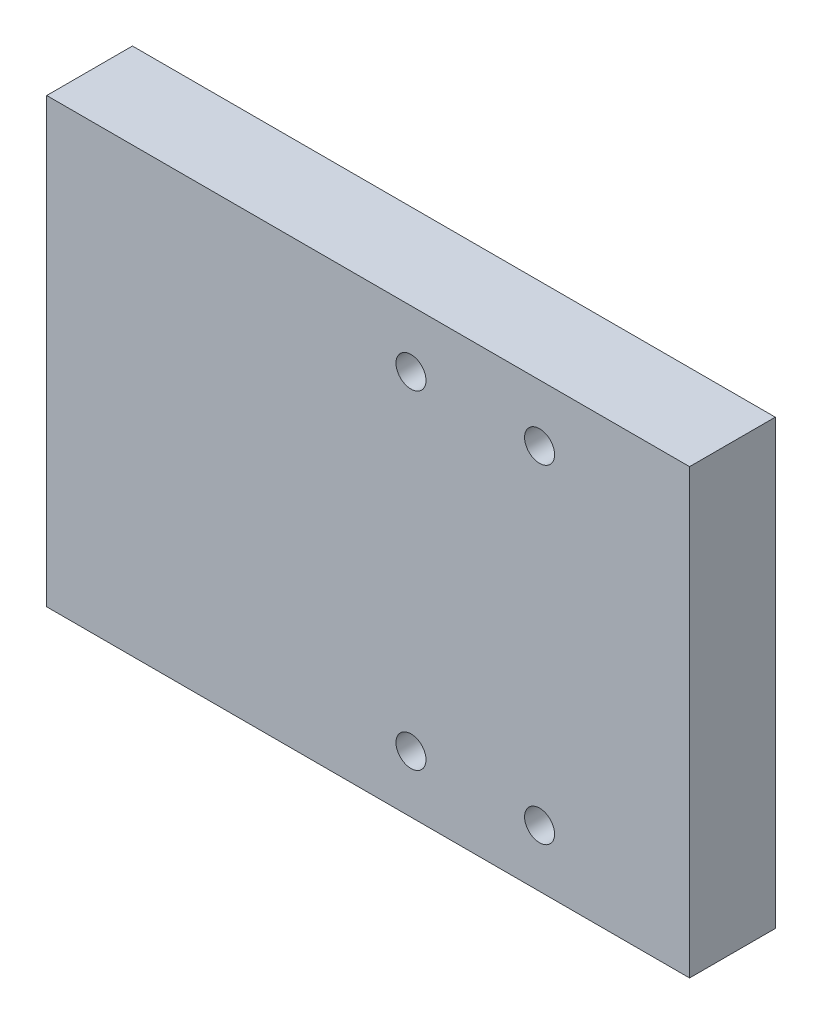
ISO-10303-21;
HEADER;
FILE_DESCRIPTION(('STEP AP214'),'2;1');
FILE_NAME('part.step','',(''),(''),'','','');
FILE_SCHEMA(('AUTOMOTIVE_DESIGN { 1 0 10303 214 1 1 1 1 }'));
ENDSEC;
DATA;
#1=APPLICATION_CONTEXT('core data for automotive mechanical design processes');
#2=APPLICATION_PROTOCOL_DEFINITION('international standard','automotive_design',2000,#1);
#3=PRODUCT_CONTEXT('',#1,'mechanical');
#4=PRODUCT('Part','Part','',(#3));
#5=PRODUCT_RELATED_PRODUCT_CATEGORY('part','',(#4));
#6=PRODUCT_DEFINITION_FORMATION('','',#4);
#7=PRODUCT_DEFINITION_CONTEXT('part definition',#1,'design');
#8=PRODUCT_DEFINITION('design','',#6,#7);
#9=PRODUCT_DEFINITION_SHAPE('','',#8);
#10=(LENGTH_UNIT() NAMED_UNIT(*) SI_UNIT(.MILLI.,.METRE.));
#11=(NAMED_UNIT(*) PLANE_ANGLE_UNIT() SI_UNIT($,.RADIAN.));
#12=(NAMED_UNIT(*) SI_UNIT($,.STERADIAN.) SOLID_ANGLE_UNIT());
#13=UNCERTAINTY_MEASURE_WITH_UNIT(LENGTH_MEASURE(1.E-05),#10,'distance_accuracy_value','');
#14=(GEOMETRIC_REPRESENTATION_CONTEXT(3) GLOBAL_UNCERTAINTY_ASSIGNED_CONTEXT((#13)) GLOBAL_UNIT_ASSIGNED_CONTEXT((#10,
#11,#12)) REPRESENTATION_CONTEXT('',''));
#15=CARTESIAN_POINT('',(0.,0.,0.));
#16=DIRECTION('',(0.,0.,1.));
#17=DIRECTION('',(1.,0.,0.));
#18=AXIS2_PLACEMENT_3D('',#15,#16,#17);
#19=CARTESIAN_POINT('',(27.9999999999999,331.,12.));
#20=DIRECTION('',(1.,0.,0.));
#21=DIRECTION('',(0.,0.,-1.));
#22=AXIS2_PLACEMENT_3D('',#19,#20,#21);
#23=PLANE('',#22);
#24=CARTESIAN_POINT('',(27.9999999999999,286.,6.00000000000001));
#25=DIRECTION('',(-1.,0.,0.));
#26=DIRECTION('',(0.,0.,1.));
#27=AXIS2_PLACEMENT_3D('',#24,#25,#26);
#28=CIRCLE('',#27,2.09999999999999);
#29=CARTESIAN_POINT('',(27.9999999999999,286.,8.1));
#30=VERTEX_POINT('',#29);
#31=EDGE_CURVE('E101',#30,#30,#28,.T.);
#32=ORIENTED_EDGE('',*,*,#31,.F.);
#33=EDGE_LOOP('',(#32));
#34=FACE_BOUND('',#33,.T.);
#35=CARTESIAN_POINT('',(27.9999999999999,314.,6.));
#36=DIRECTION('',(-1.,0.,0.));
#37=DIRECTION('',(0.,0.,1.));
#38=AXIS2_PLACEMENT_3D('',#35,#36,#37);
#39=CIRCLE('',#38,2.09999999999999);
#40=CARTESIAN_POINT('',(27.9999999999999,314.,8.09999999999999));
#41=VERTEX_POINT('',#40);
#42=EDGE_CURVE('E100',#41,#41,#39,.T.);
#43=ORIENTED_EDGE('',*,*,#42,.F.);
#44=EDGE_LOOP('',(#43));
#45=FACE_BOUND('',#44,.T.);
#46=DIRECTION('',(0.,-1.,0.));
#47=VECTOR('',#46,1.);
#48=CARTESIAN_POINT('',(27.9999999999999,331.,0.));
#49=LINE('',#48,#47);
#50=CARTESIAN_POINT('',(27.9999999999999,331.,0.));
#51=VERTEX_POINT('',#50);
#52=CARTESIAN_POINT('',(27.9999999999999,269.,0.));
#53=VERTEX_POINT('',#52);
#54=EDGE_CURVE('E132',#51,#53,#49,.T.);
#55=ORIENTED_EDGE('',*,*,#54,.T.);
#56=DIRECTION('',(0.,0.,-1.));
#57=VECTOR('',#56,1.);
#58=CARTESIAN_POINT('',(27.9999999999999,269.,12.));
#59=LINE('',#58,#57);
#60=CARTESIAN_POINT('',(27.9999999999999,269.,12.));
#61=VERTEX_POINT('',#60);
#62=EDGE_CURVE('E11',#61,#53,#59,.T.);
#63=ORIENTED_EDGE('',*,*,#62,.F.);
#64=DIRECTION('',(0.,-1.,0.));
#65=VECTOR('',#64,1.);
#66=CARTESIAN_POINT('',(27.9999999999999,331.,12.));
#67=LINE('',#66,#65);
#68=CARTESIAN_POINT('',(27.9999999999999,331.,12.));
#69=VERTEX_POINT('',#68);
#70=EDGE_CURVE('E133',#69,#61,#67,.T.);
#71=ORIENTED_EDGE('',*,*,#70,.F.);
#72=DIRECTION('',(0.,0.,-1.));
#73=VECTOR('',#72,1.);
#74=CARTESIAN_POINT('',(27.9999999999999,331.,12.));
#75=LINE('',#74,#73);
#76=EDGE_CURVE('E139',#69,#51,#75,.T.);
#77=ORIENTED_EDGE('',*,*,#76,.T.);
#78=EDGE_LOOP('',(#55,#63,#71,#77));
#79=FACE_BOUND('',#78,.T.);
#80=ADVANCED_FACE('F35',(#34,#45,#79),#23,.F.);
#81=CARTESIAN_POINT('',(27.9999999999999,269.,12.));
#82=DIRECTION('',(0.,1.,0.));
#83=DIRECTION('',(0.,0.,1.));
#84=AXIS2_PLACEMENT_3D('',#81,#82,#83);
#85=PLANE('',#84);
#86=DIRECTION('',(1.,0.,0.));
#87=VECTOR('',#86,1.);
#88=CARTESIAN_POINT('',(27.9999999999999,269.,0.));
#89=LINE('',#88,#87);
#90=CARTESIAN_POINT('',(118.,269.,0.));
#91=VERTEX_POINT('',#90);
#92=EDGE_CURVE('E142',#53,#91,#89,.T.);
#93=ORIENTED_EDGE('',*,*,#92,.T.);
#94=DIRECTION('',(0.,0.,-1.));
#95=VECTOR('',#94,1.);
#96=CARTESIAN_POINT('',(118.,269.,12.));
#97=LINE('',#96,#95);
#98=CARTESIAN_POINT('',(118.,269.,12.));
#99=VERTEX_POINT('',#98);
#100=EDGE_CURVE('E44',#99,#91,#97,.T.);
#101=ORIENTED_EDGE('',*,*,#100,.F.);
#102=DIRECTION('',(1.,0.,0.));
#103=VECTOR('',#102,1.);
#104=CARTESIAN_POINT('',(27.9999999999999,269.,12.));
#105=LINE('',#104,#103);
#106=EDGE_CURVE('E83',#61,#99,#105,.T.);
#107=ORIENTED_EDGE('',*,*,#106,.F.);
#108=ORIENTED_EDGE('',*,*,#62,.T.);
#109=EDGE_LOOP('',(#93,#101,#107,#108));
#110=FACE_BOUND('',#109,.T.);
#111=ADVANCED_FACE('F167',(#110),#85,.F.);
#112=CARTESIAN_POINT('',(118.,331.,12.));
#113=DIRECTION('',(-1.,0.,0.));
#114=DIRECTION('',(0.,0.,1.));
#115=AXIS2_PLACEMENT_3D('',#112,#113,#114);
#116=PLANE('',#115);
#117=DIRECTION('',(0.,1.,0.));
#118=VECTOR('',#117,1.);
#119=CARTESIAN_POINT('',(118.,331.,0.));
#120=LINE('',#119,#118);
#121=CARTESIAN_POINT('',(118.,331.,0.));
#122=VERTEX_POINT('',#121);
#123=EDGE_CURVE('E70',#91,#122,#120,.T.);
#124=ORIENTED_EDGE('',*,*,#123,.T.);
#125=DIRECTION('',(0.,0.,-1.));
#126=VECTOR('',#125,1.);
#127=CARTESIAN_POINT('',(118.,331.,12.));
#128=LINE('',#127,#126);
#129=CARTESIAN_POINT('',(118.,331.,12.));
#130=VERTEX_POINT('',#129);
#131=EDGE_CURVE('E147',#130,#122,#128,.T.);
#132=ORIENTED_EDGE('',*,*,#131,.F.);
#133=DIRECTION('',(0.,1.,0.));
#134=VECTOR('',#133,1.);
#135=CARTESIAN_POINT('',(118.,331.,12.));
#136=LINE('',#135,#134);
#137=EDGE_CURVE('E136',#99,#130,#136,.T.);
#138=ORIENTED_EDGE('',*,*,#137,.F.);
#139=ORIENTED_EDGE('',*,*,#100,.T.);
#140=EDGE_LOOP('',(#124,#132,#138,#139));
#141=FACE_BOUND('',#140,.T.);
#142=ADVANCED_FACE('F150',(#141),#116,.F.);
#143=CARTESIAN_POINT('',(27.9999999999999,331.,12.));
#144=DIRECTION('',(0.,-1.,0.));
#145=DIRECTION('',(0.,0.,-1.));
#146=AXIS2_PLACEMENT_3D('',#143,#144,#145);
#147=PLANE('',#146);
#148=DIRECTION('',(-1.,0.,0.));
#149=VECTOR('',#148,1.);
#150=CARTESIAN_POINT('',(27.9999999999999,331.,0.));
#151=LINE('',#150,#149);
#152=EDGE_CURVE('E76',#122,#51,#151,.T.);
#153=ORIENTED_EDGE('',*,*,#152,.T.);
#154=ORIENTED_EDGE('',*,*,#76,.F.);
#155=DIRECTION('',(-1.,0.,0.));
#156=VECTOR('',#155,1.);
#157=CARTESIAN_POINT('',(27.9999999999999,331.,12.));
#158=LINE('',#157,#156);
#159=EDGE_CURVE('E52',#130,#69,#158,.T.);
#160=ORIENTED_EDGE('',*,*,#159,.F.);
#161=ORIENTED_EDGE('',*,*,#131,.T.);
#162=EDGE_LOOP('',(#153,#154,#160,#161));
#163=FACE_BOUND('',#162,.T.);
#164=ADVANCED_FACE('F157',(#163),#147,.F.);
#165=CARTESIAN_POINT('',(0.,0.,12.));
#166=DIRECTION('',(0.,0.,1.));
#167=DIRECTION('',(1.,0.,0.));
#168=AXIS2_PLACEMENT_3D('',#165,#166,#167);
#169=PLANE('',#168);
#170=CARTESIAN_POINT('',(96.9999999999998,323.,12.));
#171=DIRECTION('',(0.,0.,1.));
#172=DIRECTION('',(1.,0.,0.));
#173=AXIS2_PLACEMENT_3D('',#170,#171,#172);
#174=CIRCLE('',#173,2.09999999999999);
#175=CARTESIAN_POINT('',(99.0999999999998,323.,12.));
#176=VERTEX_POINT('',#175);
#177=EDGE_CURVE('E111',#176,#176,#174,.T.);
#178=ORIENTED_EDGE('',*,*,#177,.F.);
#179=EDGE_LOOP('',(#178));
#180=FACE_BOUND('',#179,.T.);
#181=CARTESIAN_POINT('',(78.9999999999998,323.,12.));
#182=DIRECTION('',(0.,0.,1.));
#183=DIRECTION('',(1.,0.,0.));
#184=AXIS2_PLACEMENT_3D('',#181,#182,#183);
#185=CIRCLE('',#184,2.09999999999999);
#186=CARTESIAN_POINT('',(81.0999999999998,323.,12.));
#187=VERTEX_POINT('',#186);
#188=EDGE_CURVE('E117',#187,#187,#185,.T.);
#189=ORIENTED_EDGE('',*,*,#188,.F.);
#190=EDGE_LOOP('',(#189));
#191=FACE_BOUND('',#190,.T.);
#192=CARTESIAN_POINT('',(78.9999999999999,277.,12.));
#193=DIRECTION('',(0.,0.,1.));
#194=DIRECTION('',(1.,0.,0.));
#195=AXIS2_PLACEMENT_3D('',#192,#193,#194);
#196=CIRCLE('',#195,2.09999999999999);
#197=CARTESIAN_POINT('',(81.0999999999999,277.,12.));
#198=VERTEX_POINT('',#197);
#199=EDGE_CURVE('E123',#198,#198,#196,.T.);
#200=ORIENTED_EDGE('',*,*,#199,.F.);
#201=EDGE_LOOP('',(#200));
#202=FACE_BOUND('',#201,.T.);
#203=CARTESIAN_POINT('',(96.9999999999999,277.,12.));
#204=DIRECTION('',(0.,0.,1.));
#205=DIRECTION('',(1.,0.,0.));
#206=AXIS2_PLACEMENT_3D('',#203,#204,#205);
#207=CIRCLE('',#206,2.09999999999999);
#208=CARTESIAN_POINT('',(99.0999999999999,277.,12.));
#209=VERTEX_POINT('',#208);
#210=EDGE_CURVE('E126',#209,#209,#207,.T.);
#211=ORIENTED_EDGE('',*,*,#210,.F.);
#212=EDGE_LOOP('',(#211));
#213=FACE_BOUND('',#212,.T.);
#214=ORIENTED_EDGE('',*,*,#70,.T.);
#215=ORIENTED_EDGE('',*,*,#106,.T.);
#216=ORIENTED_EDGE('',*,*,#137,.T.);
#217=ORIENTED_EDGE('',*,*,#159,.T.);
#218=EDGE_LOOP('',(#214,#215,#216,#217));
#219=FACE_BOUND('',#218,.T.);
#220=ADVANCED_FACE('F159',(#180,#191,#202,#213,#219),#169,.T.);
#221=CARTESIAN_POINT('',(0.,0.,0.));
#222=DIRECTION('',(0.,0.,1.));
#223=DIRECTION('',(1.,0.,0.));
#224=AXIS2_PLACEMENT_3D('',#221,#222,#223);
#225=PLANE('',#224);
#226=CARTESIAN_POINT('',(96.9999999999998,323.,0.));
#227=DIRECTION('',(0.,0.,1.));
#228=DIRECTION('',(1.,0.,0.));
#229=AXIS2_PLACEMENT_3D('',#226,#227,#228);
#230=CIRCLE('',#229,2.09999999999999);
#231=CARTESIAN_POINT('',(99.0999999999998,323.,0.));
#232=VERTEX_POINT('',#231);
#233=EDGE_CURVE('E114',#232,#232,#230,.T.);
#234=ORIENTED_EDGE('',*,*,#233,.T.);
#235=EDGE_LOOP('',(#234));
#236=FACE_BOUND('',#235,.T.);
#237=CARTESIAN_POINT('',(78.9999999999998,323.,0.));
#238=DIRECTION('',(0.,0.,1.));
#239=DIRECTION('',(1.,0.,0.));
#240=AXIS2_PLACEMENT_3D('',#237,#238,#239);
#241=CIRCLE('',#240,2.09999999999999);
#242=CARTESIAN_POINT('',(81.0999999999998,323.,0.));
#243=VERTEX_POINT('',#242);
#244=EDGE_CURVE('E120',#243,#243,#241,.T.);
#245=ORIENTED_EDGE('',*,*,#244,.T.);
#246=EDGE_LOOP('',(#245));
#247=FACE_BOUND('',#246,.T.);
#248=CARTESIAN_POINT('',(78.9999999999999,277.,0.));
#249=DIRECTION('',(0.,0.,1.));
#250=DIRECTION('',(1.,0.,0.));
#251=AXIS2_PLACEMENT_3D('',#248,#249,#250);
#252=CIRCLE('',#251,2.09999999999999);
#253=CARTESIAN_POINT('',(81.0999999999999,277.,0.));
#254=VERTEX_POINT('',#253);
#255=EDGE_CURVE('E38',#254,#254,#252,.T.);
#256=ORIENTED_EDGE('',*,*,#255,.T.);
#257=EDGE_LOOP('',(#256));
#258=FACE_BOUND('',#257,.T.);
#259=CARTESIAN_POINT('',(96.9999999999999,277.,0.));
#260=DIRECTION('',(0.,0.,1.));
#261=DIRECTION('',(1.,0.,0.));
#262=AXIS2_PLACEMENT_3D('',#259,#260,#261);
#263=CIRCLE('',#262,2.09999999999999);
#264=CARTESIAN_POINT('',(99.0999999999999,277.,0.));
#265=VERTEX_POINT('',#264);
#266=EDGE_CURVE('E129',#265,#265,#263,.T.);
#267=ORIENTED_EDGE('',*,*,#266,.T.);
#268=EDGE_LOOP('',(#267));
#269=FACE_BOUND('',#268,.T.);
#270=ORIENTED_EDGE('',*,*,#54,.F.);
#271=ORIENTED_EDGE('',*,*,#152,.F.);
#272=ORIENTED_EDGE('',*,*,#123,.F.);
#273=ORIENTED_EDGE('',*,*,#92,.F.);
#274=EDGE_LOOP('',(#270,#271,#272,#273));
#275=FACE_BOUND('',#274,.T.);
#276=ADVANCED_FACE('F153',(#236,#247,#258,#269,#275),#225,.F.);
#277=CARTESIAN_POINT('',(96.9999999999999,277.,12.));
#278=DIRECTION('',(0.,0.,1.));
#279=DIRECTION('',(1.,0.,0.));
#280=AXIS2_PLACEMENT_3D('',#277,#278,#279);
#281=CYLINDRICAL_SURFACE('',#280,2.09999999999999);
#282=ORIENTED_EDGE('',*,*,#210,.T.);
#283=EDGE_LOOP('',(#282));
#284=FACE_BOUND('',#283,.T.);
#285=ORIENTED_EDGE('',*,*,#266,.F.);
#286=EDGE_LOOP('',(#285));
#287=FACE_BOUND('',#286,.T.);
#288=ADVANCED_FACE('F202',(#284,#287),#281,.F.);
#289=CARTESIAN_POINT('',(78.9999999999999,277.,12.));
#290=DIRECTION('',(0.,0.,1.));
#291=DIRECTION('',(1.,0.,0.));
#292=AXIS2_PLACEMENT_3D('',#289,#290,#291);
#293=CYLINDRICAL_SURFACE('',#292,2.09999999999999);
#294=ORIENTED_EDGE('',*,*,#199,.T.);
#295=EDGE_LOOP('',(#294));
#296=FACE_BOUND('',#295,.T.);
#297=ORIENTED_EDGE('',*,*,#255,.F.);
#298=EDGE_LOOP('',(#297));
#299=FACE_BOUND('',#298,.T.);
#300=ADVANCED_FACE('F198',(#296,#299),#293,.F.);
#301=CARTESIAN_POINT('',(78.9999999999998,323.,12.));
#302=DIRECTION('',(0.,0.,1.));
#303=DIRECTION('',(1.,0.,0.));
#304=AXIS2_PLACEMENT_3D('',#301,#302,#303);
#305=CYLINDRICAL_SURFACE('',#304,2.09999999999999);
#306=ORIENTED_EDGE('',*,*,#188,.T.);
#307=EDGE_LOOP('',(#306));
#308=FACE_BOUND('',#307,.T.);
#309=ORIENTED_EDGE('',*,*,#244,.F.);
#310=EDGE_LOOP('',(#309));
#311=FACE_BOUND('',#310,.T.);
#312=ADVANCED_FACE('F194',(#308,#311),#305,.F.);
#313=CARTESIAN_POINT('',(96.9999999999998,323.,12.));
#314=DIRECTION('',(0.,0.,1.));
#315=DIRECTION('',(1.,0.,0.));
#316=AXIS2_PLACEMENT_3D('',#313,#314,#315);
#317=CYLINDRICAL_SURFACE('',#316,2.09999999999999);
#318=ORIENTED_EDGE('',*,*,#177,.T.);
#319=EDGE_LOOP('',(#318));
#320=FACE_BOUND('',#319,.T.);
#321=ORIENTED_EDGE('',*,*,#233,.F.);
#322=EDGE_LOOP('',(#321));
#323=FACE_BOUND('',#322,.T.);
#324=ADVANCED_FACE('F186',(#320,#323),#317,.F.);
#325=CARTESIAN_POINT('',(47.9999999999999,314.,6.));
#326=DIRECTION('',(-1.,0.,0.));
#327=DIRECTION('',(0.,0.,1.));
#328=AXIS2_PLACEMENT_3D('',#325,#326,#327);
#329=CONICAL_SURFACE('',#328,2.09999999999999,1.02974425867666);
#330=CARTESIAN_POINT('',(49.2618072999578,314.,6.));
#331=VERTEX_POINT('',#330);
#332=VERTEX_LOOP('',#331);
#333=FACE_BOUND('',#332,.T.);
#334=CARTESIAN_POINT('',(47.9999999999999,314.,6.));
#335=DIRECTION('',(-1.,0.,0.));
#336=DIRECTION('',(0.,0.,1.));
#337=AXIS2_PLACEMENT_3D('',#334,#335,#336);
#338=CIRCLE('',#337,2.09999999999999);
#339=CARTESIAN_POINT('',(47.9999999999999,314.,8.09999999999999));
#340=VERTEX_POINT('',#339);
#341=EDGE_CURVE('E104',#340,#340,#338,.T.);
#342=ORIENTED_EDGE('',*,*,#341,.T.);
#343=EDGE_LOOP('',(#342));
#344=FACE_BOUND('',#343,.T.);
#345=ADVANCED_FACE('F180',(#333,#344),#329,.F.);
#346=CARTESIAN_POINT('',(27.9999999999999,314.,6.));
#347=DIRECTION('',(-1.,0.,0.));
#348=DIRECTION('',(0.,0.,1.));
#349=AXIS2_PLACEMENT_3D('',#346,#347,#348);
#350=CYLINDRICAL_SURFACE('',#349,2.09999999999999);
#351=ORIENTED_EDGE('',*,*,#341,.F.);
#352=EDGE_LOOP('',(#351));
#353=FACE_BOUND('',#352,.T.);
#354=ORIENTED_EDGE('',*,*,#42,.T.);
#355=EDGE_LOOP('',(#354));
#356=FACE_BOUND('',#355,.T.);
#357=ADVANCED_FACE('F94',(#353,#356),#350,.F.);
#358=CARTESIAN_POINT('',(47.9999999999999,286.,6.00000000000001));
#359=DIRECTION('',(-1.,0.,0.));
#360=DIRECTION('',(0.,0.,1.));
#361=AXIS2_PLACEMENT_3D('',#358,#359,#360);
#362=CONICAL_SURFACE('',#361,2.09999999999999,1.02974425867666);
#363=CARTESIAN_POINT('',(49.2618072999578,286.,6.00000000000001));
#364=VERTEX_POINT('',#363);
#365=VERTEX_LOOP('',#364);
#366=FACE_BOUND('',#365,.T.);
#367=CARTESIAN_POINT('',(47.9999999999999,286.,6.00000000000001));
#368=DIRECTION('',(-1.,0.,0.));
#369=DIRECTION('',(0.,0.,1.));
#370=AXIS2_PLACEMENT_3D('',#367,#368,#369);
#371=CIRCLE('',#370,2.09999999999999);
#372=CARTESIAN_POINT('',(47.9999999999999,286.,8.1));
#373=VERTEX_POINT('',#372);
#374=EDGE_CURVE('E98',#373,#373,#371,.T.);
#375=ORIENTED_EDGE('',*,*,#374,.T.);
#376=EDGE_LOOP('',(#375));
#377=FACE_BOUND('',#376,.T.);
#378=ADVANCED_FACE('F90',(#366,#377),#362,.F.);
#379=CARTESIAN_POINT('',(27.9999999999999,286.,6.00000000000001));
#380=DIRECTION('',(-1.,0.,0.));
#381=DIRECTION('',(0.,0.,1.));
#382=AXIS2_PLACEMENT_3D('',#379,#380,#381);
#383=CYLINDRICAL_SURFACE('',#382,2.09999999999999);
#384=ORIENTED_EDGE('',*,*,#374,.F.);
#385=EDGE_LOOP('',(#384));
#386=FACE_BOUND('',#385,.T.);
#387=ORIENTED_EDGE('',*,*,#31,.T.);
#388=EDGE_LOOP('',(#387));
#389=FACE_BOUND('',#388,.T.);
#390=ADVANCED_FACE('F93',(#386,#389),#383,.F.);
#391=CLOSED_SHELL('',(#80,#111,#142,#164,#220,#276,#288,#300,#312,#324,#345,#357,#378,#390));
#392=MANIFOLD_SOLID_BREP('B2',#391);
#393=ADVANCED_BREP_SHAPE_REPRESENTATION('',(#18,#392),#14);
#394=SHAPE_DEFINITION_REPRESENTATION(#9,#393);
ENDSEC;
END-ISO-10303-21;
